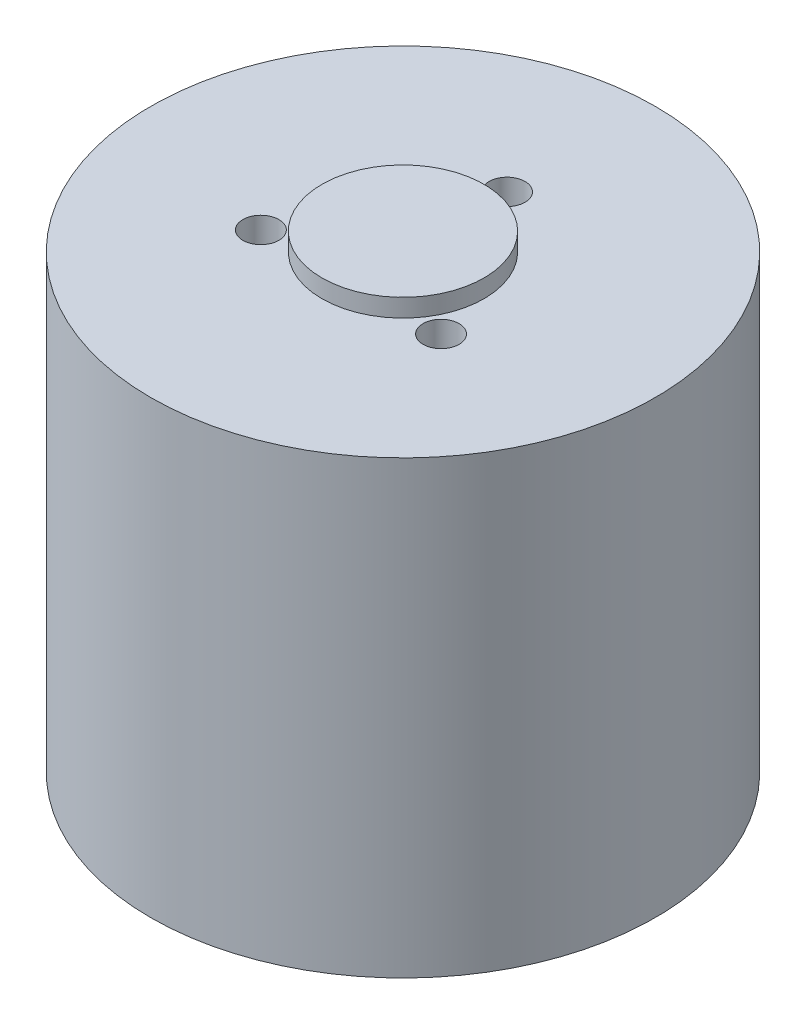
ISO-10303-21;
HEADER;
FILE_DESCRIPTION(('STEP AP214'),'2;1');
FILE_NAME('part.step','',(''),(''),'','','');
FILE_SCHEMA(('AUTOMOTIVE_DESIGN { 1 0 10303 214 1 1 1 1 }'));
ENDSEC;
DATA;
#1=APPLICATION_CONTEXT('core data for automotive mechanical design processes');
#2=APPLICATION_PROTOCOL_DEFINITION('international standard','automotive_design',2000,#1);
#3=PRODUCT_CONTEXT('',#1,'mechanical');
#4=PRODUCT('Part','Part','',(#3));
#5=PRODUCT_RELATED_PRODUCT_CATEGORY('part','',(#4));
#6=PRODUCT_DEFINITION_FORMATION('','',#4);
#7=PRODUCT_DEFINITION_CONTEXT('part definition',#1,'design');
#8=PRODUCT_DEFINITION('design','',#6,#7);
#9=PRODUCT_DEFINITION_SHAPE('','',#8);
#10=(LENGTH_UNIT() NAMED_UNIT(*) SI_UNIT(.MILLI.,.METRE.));
#11=(NAMED_UNIT(*) PLANE_ANGLE_UNIT() SI_UNIT($,.RADIAN.));
#12=(NAMED_UNIT(*) SI_UNIT($,.STERADIAN.) SOLID_ANGLE_UNIT());
#13=UNCERTAINTY_MEASURE_WITH_UNIT(LENGTH_MEASURE(1.E-05),#10,'distance_accuracy_value','');
#14=(GEOMETRIC_REPRESENTATION_CONTEXT(3) GLOBAL_UNCERTAINTY_ASSIGNED_CONTEXT((#13)) GLOBAL_UNIT_ASSIGNED_CONTEXT((#10,
#11,#12)) REPRESENTATION_CONTEXT('',''));
#15=CARTESIAN_POINT('',(0.,0.,0.));
#16=DIRECTION('',(0.,0.,1.));
#17=DIRECTION('',(1.,0.,0.));
#18=AXIS2_PLACEMENT_3D('',#15,#16,#17);
#19=CARTESIAN_POINT('',(0.,25.,0.));
#20=DIRECTION('',(0.,-1.,0.));
#21=DIRECTION('',(0.,0.,-1.));
#22=AXIS2_PLACEMENT_3D('',#19,#20,#21);
#23=CYLINDRICAL_SURFACE('',#22,14.);
#24=CARTESIAN_POINT('',(0.,25.,0.));
#25=DIRECTION('',(0.,1.,0.));
#26=DIRECTION('',(0.,0.,1.));
#27=AXIS2_PLACEMENT_3D('',#24,#25,#26);
#28=CIRCLE('',#27,14.);
#29=CARTESIAN_POINT('',(0.,25.,14.));
#30=VERTEX_POINT('',#29);
#31=EDGE_CURVE('E37',#30,#30,#28,.T.);
#32=ORIENTED_EDGE('',*,*,#31,.F.);
#33=EDGE_LOOP('',(#32));
#34=FACE_BOUND('',#33,.T.);
#35=CARTESIAN_POINT('',(0.,0.,0.));
#36=DIRECTION('',(0.,1.,0.));
#37=DIRECTION('',(0.,0.,1.));
#38=AXIS2_PLACEMENT_3D('',#35,#36,#37);
#39=CIRCLE('',#38,14.);
#40=CARTESIAN_POINT('',(0.,0.,14.));
#41=VERTEX_POINT('',#40);
#42=EDGE_CURVE('E33',#41,#41,#39,.T.);
#43=ORIENTED_EDGE('',*,*,#42,.T.);
#44=EDGE_LOOP('',(#43));
#45=FACE_BOUND('',#44,.T.);
#46=ADVANCED_FACE('F30',(#34,#45),#23,.T.);
#47=CARTESIAN_POINT('',(0.,25.,0.));
#48=DIRECTION('',(0.,1.,0.));
#49=DIRECTION('',(0.,0.,1.));
#50=AXIS2_PLACEMENT_3D('',#47,#48,#49);
#51=PLANE('',#50);
#52=CARTESIAN_POINT('',(0.,25.,-5.77350269189632));
#53=DIRECTION('',(0.,1.,0.));
#54=DIRECTION('',(0.,0.,1.));
#55=AXIS2_PLACEMENT_3D('',#52,#53,#54);
#56=CIRCLE('',#55,1.);
#57=CARTESIAN_POINT('',(0.,25.,-4.77350269189632));
#58=VERTEX_POINT('',#57);
#59=EDGE_CURVE('E60',#58,#58,#56,.T.);
#60=ORIENTED_EDGE('',*,*,#59,.F.);
#61=EDGE_LOOP('',(#60));
#62=FACE_BOUND('',#61,.T.);
#63=CARTESIAN_POINT('',(4.99999999999992,25.,2.88675134594811));
#64=DIRECTION('',(0.,1.,0.));
#65=DIRECTION('',(0.,0.,1.));
#66=AXIS2_PLACEMENT_3D('',#63,#64,#65);
#67=CIRCLE('',#66,1.);
#68=CARTESIAN_POINT('',(4.99999999999992,25.,3.88675134594811));
#69=VERTEX_POINT('',#68);
#70=EDGE_CURVE('E54',#69,#69,#67,.T.);
#71=ORIENTED_EDGE('',*,*,#70,.F.);
#72=EDGE_LOOP('',(#71));
#73=FACE_BOUND('',#72,.T.);
#74=CARTESIAN_POINT('',(-5.00000000000008,25.,2.88675134594811));
#75=DIRECTION('',(0.,1.,0.));
#76=DIRECTION('',(0.,0.,1.));
#77=AXIS2_PLACEMENT_3D('',#74,#75,#76);
#78=CIRCLE('',#77,1.);
#79=CARTESIAN_POINT('',(-5.00000000000008,25.,3.88675134594811));
#80=VERTEX_POINT('',#79);
#81=EDGE_CURVE('E47',#80,#80,#78,.T.);
#82=ORIENTED_EDGE('',*,*,#81,.F.);
#83=EDGE_LOOP('',(#82));
#84=FACE_BOUND('',#83,.T.);
#85=CARTESIAN_POINT('',(0.,25.,0.));
#86=DIRECTION('',(0.,1.,0.));
#87=DIRECTION('',(0.,0.,1.));
#88=AXIS2_PLACEMENT_3D('',#85,#86,#87);
#89=CIRCLE('',#88,4.5);
#90=CARTESIAN_POINT('',(0.,25.,4.5));
#91=VERTEX_POINT('',#90);
#92=EDGE_CURVE('E10',#91,#91,#89,.T.);
#93=ORIENTED_EDGE('',*,*,#92,.F.);
#94=EDGE_LOOP('',(#93));
#95=FACE_BOUND('',#94,.T.);
#96=ORIENTED_EDGE('',*,*,#31,.T.);
#97=EDGE_LOOP('',(#96));
#98=FACE_BOUND('',#97,.T.);
#99=ADVANCED_FACE('F102',(#62,#73,#84,#95,#98),#51,.T.);
#100=CARTESIAN_POINT('',(0.,0.,0.));
#101=DIRECTION('',(0.,1.,0.));
#102=DIRECTION('',(0.,0.,1.));
#103=AXIS2_PLACEMENT_3D('',#100,#101,#102);
#104=PLANE('',#103);
#105=CARTESIAN_POINT('',(9.5,0.,0.));
#106=DIRECTION('',(0.,-1.,0.));
#107=DIRECTION('',(0.,0.,-1.));
#108=AXIS2_PLACEMENT_3D('',#105,#106,#107);
#109=CIRCLE('',#108,1.5);
#110=CARTESIAN_POINT('',(9.5,0.,-1.5));
#111=VERTEX_POINT('',#110);
#112=EDGE_CURVE('E83',#111,#111,#109,.T.);
#113=ORIENTED_EDGE('',*,*,#112,.F.);
#114=EDGE_LOOP('',(#113));
#115=FACE_BOUND('',#114,.T.);
#116=CARTESIAN_POINT('',(-9.5,0.,0.));
#117=DIRECTION('',(0.,-1.,0.));
#118=DIRECTION('',(0.,0.,-1.));
#119=AXIS2_PLACEMENT_3D('',#116,#117,#118);
#120=CIRCLE('',#119,1.5);
#121=CARTESIAN_POINT('',(-9.5,0.,-1.5));
#122=VERTEX_POINT('',#121);
#123=EDGE_CURVE('E77',#122,#122,#120,.T.);
#124=ORIENTED_EDGE('',*,*,#123,.F.);
#125=EDGE_LOOP('',(#124));
#126=FACE_BOUND('',#125,.T.);
#127=CARTESIAN_POINT('',(0.,0.,-8.));
#128=DIRECTION('',(0.,-1.,0.));
#129=DIRECTION('',(0.,0.,-1.));
#130=AXIS2_PLACEMENT_3D('',#127,#128,#129);
#131=CIRCLE('',#130,1.5);
#132=CARTESIAN_POINT('',(0.,0.,-9.5));
#133=VERTEX_POINT('',#132);
#134=EDGE_CURVE('E71',#133,#133,#131,.T.);
#135=ORIENTED_EDGE('',*,*,#134,.F.);
#136=EDGE_LOOP('',(#135));
#137=FACE_BOUND('',#136,.T.);
#138=CARTESIAN_POINT('',(0.,0.,8.));
#139=DIRECTION('',(0.,-1.,0.));
#140=DIRECTION('',(0.,0.,-1.));
#141=AXIS2_PLACEMENT_3D('',#138,#139,#140);
#142=CIRCLE('',#141,1.5);
#143=CARTESIAN_POINT('',(0.,0.,6.5));
#144=VERTEX_POINT('',#143);
#145=EDGE_CURVE('E65',#144,#144,#142,.T.);
#146=ORIENTED_EDGE('',*,*,#145,.F.);
#147=EDGE_LOOP('',(#146));
#148=FACE_BOUND('',#147,.T.);
#149=ORIENTED_EDGE('',*,*,#42,.F.);
#150=EDGE_LOOP('',(#149));
#151=FACE_BOUND('',#150,.T.);
#152=ADVANCED_FACE('F98',(#115,#126,#137,#148,#151),#104,.F.);
#153=CARTESIAN_POINT('',(0.,26.,0.));
#154=DIRECTION('',(0.,-1.,0.));
#155=DIRECTION('',(0.,0.,-1.));
#156=AXIS2_PLACEMENT_3D('',#153,#154,#155);
#157=CYLINDRICAL_SURFACE('',#156,4.5);
#158=CARTESIAN_POINT('',(0.,26.,0.));
#159=DIRECTION('',(0.,1.,0.));
#160=DIRECTION('',(0.,0.,1.));
#161=AXIS2_PLACEMENT_3D('',#158,#159,#160);
#162=CIRCLE('',#161,4.5);
#163=CARTESIAN_POINT('',(0.,26.,4.5));
#164=VERTEX_POINT('',#163);
#165=EDGE_CURVE('E43',#164,#164,#162,.T.);
#166=ORIENTED_EDGE('',*,*,#165,.F.);
#167=EDGE_LOOP('',(#166));
#168=FACE_BOUND('',#167,.T.);
#169=ORIENTED_EDGE('',*,*,#92,.T.);
#170=EDGE_LOOP('',(#169));
#171=FACE_BOUND('',#170,.T.);
#172=ADVANCED_FACE('F101',(#168,#171),#157,.T.);
#173=CARTESIAN_POINT('',(0.,26.,0.));
#174=DIRECTION('',(0.,1.,0.));
#175=DIRECTION('',(0.,0.,1.));
#176=AXIS2_PLACEMENT_3D('',#173,#174,#175);
#177=PLANE('',#176);
#178=ORIENTED_EDGE('',*,*,#165,.T.);
#179=EDGE_LOOP('',(#178));
#180=FACE_BOUND('',#179,.T.);
#181=ADVANCED_FACE('F128',(#180),#177,.T.);
#182=CARTESIAN_POINT('',(-5.00000000000008,21.,2.88675134594811));
#183=DIRECTION('',(0.,1.,0.));
#184=DIRECTION('',(0.,0.,1.));
#185=AXIS2_PLACEMENT_3D('',#182,#183,#184);
#186=CYLINDRICAL_SURFACE('',#185,1.);
#187=CARTESIAN_POINT('',(-5.00000000000008,21.,2.88675134594811));
#188=DIRECTION('',(0.,1.,0.));
#189=DIRECTION('',(0.,0.,1.));
#190=AXIS2_PLACEMENT_3D('',#187,#188,#189);
#191=CIRCLE('',#190,1.);
#192=CARTESIAN_POINT('',(-5.00000000000008,21.,3.88675134594811));
#193=VERTEX_POINT('',#192);
#194=EDGE_CURVE('E50',#193,#193,#191,.T.);
#195=ORIENTED_EDGE('',*,*,#194,.F.);
#196=EDGE_LOOP('',(#195));
#197=FACE_BOUND('',#196,.T.);
#198=ORIENTED_EDGE('',*,*,#81,.T.);
#199=EDGE_LOOP('',(#198));
#200=FACE_BOUND('',#199,.T.);
#201=ADVANCED_FACE('F132',(#197,#200),#186,.F.);
#202=CARTESIAN_POINT('',(-5.00000000000008,21.,2.88675134594811));
#203=DIRECTION('',(0.,1.,0.));
#204=DIRECTION('',(0.,0.,1.));
#205=AXIS2_PLACEMENT_3D('',#202,#203,#204);
#206=PLANE('',#205);
#207=ORIENTED_EDGE('',*,*,#194,.T.);
#208=EDGE_LOOP('',(#207));
#209=FACE_BOUND('',#208,.T.);
#210=ADVANCED_FACE('F136',(#209),#206,.T.);
#211=CARTESIAN_POINT('',(4.99999999999992,21.,2.88675134594811));
#212=DIRECTION('',(0.,1.,0.));
#213=DIRECTION('',(0.,0.,1.));
#214=AXIS2_PLACEMENT_3D('',#211,#212,#213);
#215=CYLINDRICAL_SURFACE('',#214,1.);
#216=CARTESIAN_POINT('',(4.99999999999992,21.,2.88675134594811));
#217=DIRECTION('',(0.,1.,0.));
#218=DIRECTION('',(0.,0.,1.));
#219=AXIS2_PLACEMENT_3D('',#216,#217,#218);
#220=CIRCLE('',#219,1.);
#221=CARTESIAN_POINT('',(4.99999999999992,21.,3.88675134594811));
#222=VERTEX_POINT('',#221);
#223=EDGE_CURVE('E57',#222,#222,#220,.T.);
#224=ORIENTED_EDGE('',*,*,#223,.F.);
#225=EDGE_LOOP('',(#224));
#226=FACE_BOUND('',#225,.T.);
#227=ORIENTED_EDGE('',*,*,#70,.T.);
#228=EDGE_LOOP('',(#227));
#229=FACE_BOUND('',#228,.T.);
#230=ADVANCED_FACE('F140',(#226,#229),#215,.F.);
#231=CARTESIAN_POINT('',(4.99999999999992,21.,2.88675134594811));
#232=DIRECTION('',(0.,1.,0.));
#233=DIRECTION('',(0.,0.,1.));
#234=AXIS2_PLACEMENT_3D('',#231,#232,#233);
#235=PLANE('',#234);
#236=ORIENTED_EDGE('',*,*,#223,.T.);
#237=EDGE_LOOP('',(#236));
#238=FACE_BOUND('',#237,.T.);
#239=ADVANCED_FACE('F144',(#238),#235,.T.);
#240=CARTESIAN_POINT('',(0.,21.,-5.77350269189632));
#241=DIRECTION('',(0.,1.,0.));
#242=DIRECTION('',(0.,0.,1.));
#243=AXIS2_PLACEMENT_3D('',#240,#241,#242);
#244=CYLINDRICAL_SURFACE('',#243,1.);
#245=CARTESIAN_POINT('',(0.,21.,-5.77350269189632));
#246=DIRECTION('',(0.,1.,0.));
#247=DIRECTION('',(0.,0.,1.));
#248=AXIS2_PLACEMENT_3D('',#245,#246,#247);
#249=CIRCLE('',#248,1.);
#250=CARTESIAN_POINT('',(0.,21.,-4.77350269189632));
#251=VERTEX_POINT('',#250);
#252=EDGE_CURVE('E46',#251,#251,#249,.T.);
#253=ORIENTED_EDGE('',*,*,#252,.F.);
#254=EDGE_LOOP('',(#253));
#255=FACE_BOUND('',#254,.T.);
#256=ORIENTED_EDGE('',*,*,#59,.T.);
#257=EDGE_LOOP('',(#256));
#258=FACE_BOUND('',#257,.T.);
#259=ADVANCED_FACE('F148',(#255,#258),#244,.F.);
#260=CARTESIAN_POINT('',(0.,21.,-5.77350269189632));
#261=DIRECTION('',(0.,1.,0.));
#262=DIRECTION('',(0.,0.,1.));
#263=AXIS2_PLACEMENT_3D('',#260,#261,#262);
#264=PLANE('',#263);
#265=ORIENTED_EDGE('',*,*,#252,.T.);
#266=EDGE_LOOP('',(#265));
#267=FACE_BOUND('',#266,.T.);
#268=ADVANCED_FACE('F152',(#267),#264,.T.);
#269=CARTESIAN_POINT('',(0.,4.,8.));
#270=DIRECTION('',(0.,-1.,0.));
#271=DIRECTION('',(0.,0.,-1.));
#272=AXIS2_PLACEMENT_3D('',#269,#270,#271);
#273=CYLINDRICAL_SURFACE('',#272,1.5);
#274=CARTESIAN_POINT('',(0.,4.,8.));
#275=DIRECTION('',(0.,-1.,0.));
#276=DIRECTION('',(0.,0.,-1.));
#277=AXIS2_PLACEMENT_3D('',#274,#275,#276);
#278=CIRCLE('',#277,1.5);
#279=CARTESIAN_POINT('',(0.,4.,6.5));
#280=VERTEX_POINT('',#279);
#281=EDGE_CURVE('E68',#280,#280,#278,.T.);
#282=ORIENTED_EDGE('',*,*,#281,.F.);
#283=EDGE_LOOP('',(#282));
#284=FACE_BOUND('',#283,.T.);
#285=ORIENTED_EDGE('',*,*,#145,.T.);
#286=EDGE_LOOP('',(#285));
#287=FACE_BOUND('',#286,.T.);
#288=ADVANCED_FACE('F156',(#284,#287),#273,.F.);
#289=CARTESIAN_POINT('',(0.,4.,8.));
#290=DIRECTION('',(0.,-1.,0.));
#291=DIRECTION('',(0.,0.,-1.));
#292=AXIS2_PLACEMENT_3D('',#289,#290,#291);
#293=PLANE('',#292);
#294=ORIENTED_EDGE('',*,*,#281,.T.);
#295=EDGE_LOOP('',(#294));
#296=FACE_BOUND('',#295,.T.);
#297=ADVANCED_FACE('F160',(#296),#293,.T.);
#298=CARTESIAN_POINT('',(0.,4.,-8.));
#299=DIRECTION('',(0.,-1.,0.));
#300=DIRECTION('',(0.,0.,-1.));
#301=AXIS2_PLACEMENT_3D('',#298,#299,#300);
#302=CYLINDRICAL_SURFACE('',#301,1.5);
#303=CARTESIAN_POINT('',(0.,4.,-8.));
#304=DIRECTION('',(0.,-1.,0.));
#305=DIRECTION('',(0.,0.,-1.));
#306=AXIS2_PLACEMENT_3D('',#303,#304,#305);
#307=CIRCLE('',#306,1.5);
#308=CARTESIAN_POINT('',(0.,4.,-9.5));
#309=VERTEX_POINT('',#308);
#310=EDGE_CURVE('E74',#309,#309,#307,.T.);
#311=ORIENTED_EDGE('',*,*,#310,.F.);
#312=EDGE_LOOP('',(#311));
#313=FACE_BOUND('',#312,.T.);
#314=ORIENTED_EDGE('',*,*,#134,.T.);
#315=EDGE_LOOP('',(#314));
#316=FACE_BOUND('',#315,.T.);
#317=ADVANCED_FACE('F164',(#313,#316),#302,.F.);
#318=CARTESIAN_POINT('',(0.,4.,-8.));
#319=DIRECTION('',(0.,-1.,0.));
#320=DIRECTION('',(0.,0.,-1.));
#321=AXIS2_PLACEMENT_3D('',#318,#319,#320);
#322=PLANE('',#321);
#323=ORIENTED_EDGE('',*,*,#310,.T.);
#324=EDGE_LOOP('',(#323));
#325=FACE_BOUND('',#324,.T.);
#326=ADVANCED_FACE('F168',(#325),#322,.T.);
#327=CARTESIAN_POINT('',(-9.5,4.,0.));
#328=DIRECTION('',(0.,-1.,0.));
#329=DIRECTION('',(0.,0.,-1.));
#330=AXIS2_PLACEMENT_3D('',#327,#328,#329);
#331=CYLINDRICAL_SURFACE('',#330,1.5);
#332=CARTESIAN_POINT('',(-9.5,4.,0.));
#333=DIRECTION('',(0.,-1.,0.));
#334=DIRECTION('',(0.,0.,-1.));
#335=AXIS2_PLACEMENT_3D('',#332,#333,#334);
#336=CIRCLE('',#335,1.5);
#337=CARTESIAN_POINT('',(-9.5,4.,-1.5));
#338=VERTEX_POINT('',#337);
#339=EDGE_CURVE('E80',#338,#338,#336,.T.);
#340=ORIENTED_EDGE('',*,*,#339,.F.);
#341=EDGE_LOOP('',(#340));
#342=FACE_BOUND('',#341,.T.);
#343=ORIENTED_EDGE('',*,*,#123,.T.);
#344=EDGE_LOOP('',(#343));
#345=FACE_BOUND('',#344,.T.);
#346=ADVANCED_FACE('F172',(#342,#345),#331,.F.);
#347=CARTESIAN_POINT('',(-9.5,4.,0.));
#348=DIRECTION('',(0.,-1.,0.));
#349=DIRECTION('',(0.,0.,-1.));
#350=AXIS2_PLACEMENT_3D('',#347,#348,#349);
#351=PLANE('',#350);
#352=ORIENTED_EDGE('',*,*,#339,.T.);
#353=EDGE_LOOP('',(#352));
#354=FACE_BOUND('',#353,.T.);
#355=ADVANCED_FACE('F94',(#354),#351,.T.);
#356=CARTESIAN_POINT('',(9.5,4.,0.));
#357=DIRECTION('',(0.,-1.,0.));
#358=DIRECTION('',(0.,0.,-1.));
#359=AXIS2_PLACEMENT_3D('',#356,#357,#358);
#360=CYLINDRICAL_SURFACE('',#359,1.5);
#361=CARTESIAN_POINT('',(9.5,4.,0.));
#362=DIRECTION('',(0.,-1.,0.));
#363=DIRECTION('',(0.,0.,-1.));
#364=AXIS2_PLACEMENT_3D('',#361,#362,#363);
#365=CIRCLE('',#364,1.5);
#366=CARTESIAN_POINT('',(9.5,4.,-1.5));
#367=VERTEX_POINT('',#366);
#368=EDGE_CURVE('E51',#367,#367,#365,.T.);
#369=ORIENTED_EDGE('',*,*,#368,.F.);
#370=EDGE_LOOP('',(#369));
#371=FACE_BOUND('',#370,.T.);
#372=ORIENTED_EDGE('',*,*,#112,.T.);
#373=EDGE_LOOP('',(#372));
#374=FACE_BOUND('',#373,.T.);
#375=ADVANCED_FACE('F91',(#371,#374),#360,.F.);
#376=CARTESIAN_POINT('',(9.5,4.,0.));
#377=DIRECTION('',(0.,-1.,0.));
#378=DIRECTION('',(0.,0.,-1.));
#379=AXIS2_PLACEMENT_3D('',#376,#377,#378);
#380=PLANE('',#379);
#381=ORIENTED_EDGE('',*,*,#368,.T.);
#382=EDGE_LOOP('',(#381));
#383=FACE_BOUND('',#382,.T.);
#384=ADVANCED_FACE('F89',(#383),#380,.T.);
#385=CLOSED_SHELL('',(#46,#99,#152,#172,#181,#201,#210,#230,#239,#259,#268,#288,#297,#317,#326,
#346,#355,#375,#384));
#386=MANIFOLD_SOLID_BREP('B2',#385);
#387=ADVANCED_BREP_SHAPE_REPRESENTATION('',(#18,#386),#14);
#388=SHAPE_DEFINITION_REPRESENTATION(#9,#387);
ENDSEC;
END-ISO-10303-21;
